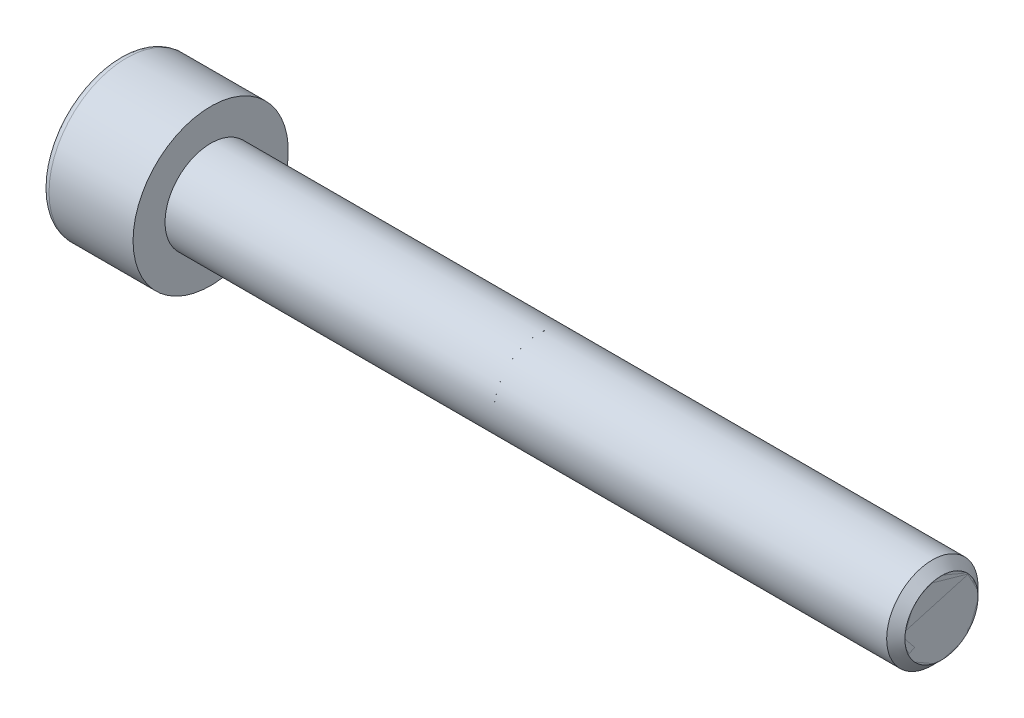
ISO-10303-21;
HEADER;
FILE_DESCRIPTION(('STEP AP214'),'2;1');
FILE_NAME('part.step','',(''),(''),'','','');
FILE_SCHEMA(('AUTOMOTIVE_DESIGN { 1 0 10303 214 1 1 1 1 }'));
ENDSEC;
DATA;
#1=APPLICATION_CONTEXT('core data for automotive mechanical design processes');
#2=APPLICATION_PROTOCOL_DEFINITION('international standard','automotive_design',2000,#1);
#3=PRODUCT_CONTEXT('',#1,'mechanical');
#4=PRODUCT('Part','Part','',(#3));
#5=PRODUCT_RELATED_PRODUCT_CATEGORY('part','',(#4));
#6=PRODUCT_DEFINITION_FORMATION('','',#4);
#7=PRODUCT_DEFINITION_CONTEXT('part definition',#1,'design');
#8=PRODUCT_DEFINITION('design','',#6,#7);
#9=PRODUCT_DEFINITION_SHAPE('','',#8);
#10=(LENGTH_UNIT() NAMED_UNIT(*) SI_UNIT(.MILLI.,.METRE.));
#11=(NAMED_UNIT(*) PLANE_ANGLE_UNIT() SI_UNIT($,.RADIAN.));
#12=(NAMED_UNIT(*) SI_UNIT($,.STERADIAN.) SOLID_ANGLE_UNIT());
#13=UNCERTAINTY_MEASURE_WITH_UNIT(LENGTH_MEASURE(1.E-05),#10,'distance_accuracy_value','');
#14=(GEOMETRIC_REPRESENTATION_CONTEXT(3) GLOBAL_UNCERTAINTY_ASSIGNED_CONTEXT((#13)) GLOBAL_UNIT_ASSIGNED_CONTEXT((#10,
#11,#12)) REPRESENTATION_CONTEXT('',''));
#15=CARTESIAN_POINT('',(0.,0.,0.));
#16=DIRECTION('',(0.,0.,1.));
#17=DIRECTION('',(1.,0.,0.));
#18=AXIS2_PLACEMENT_3D('',#15,#16,#17);
#19=CARTESIAN_POINT('',(2.5,0.,0.));
#20=DIRECTION('',(-1.,0.,0.));
#21=DIRECTION('',(0.,0.,1.));
#22=AXIS2_PLACEMENT_3D('',#19,#20,#21);
#23=PLANE('',#22);
#24=DIRECTION('',(0.,0.,-1.));
#25=VECTOR('',#24,1.);
#26=CARTESIAN_POINT('',(2.5,-2.,-1.154700538379));
#27=LINE('',#26,#25);
#28=CARTESIAN_POINT('',(2.5,-2.00000000000008,-1.15470053837913));
#29=VERTEX_POINT('',#28);
#30=CARTESIAN_POINT('',(2.5,-2.,1.154700538379));
#31=VERTEX_POINT('',#30);
#32=EDGE_CURVE('P0_E65',#29,#31,#27,.F.);
#33=ORIENTED_EDGE('',*,*,#32,.T.);
#34=DIRECTION('',(0.,-0.866025403784429,-0.500000000000017));
#35=VECTOR('',#34,1.);
#36=CARTESIAN_POINT('',(2.5,-2.,1.154700538379));
#37=LINE('',#36,#35);
#38=CARTESIAN_POINT('',(2.5,0.,2.30940107675887));
#39=VERTEX_POINT('',#38);
#40=EDGE_CURVE('P0_E137',#31,#39,#37,.F.);
#41=ORIENTED_EDGE('',*,*,#40,.T.);
#42=DIRECTION('',(0.,-0.866025403784429,0.500000000000017));
#43=VECTOR('',#42,1.);
#44=CARTESIAN_POINT('',(2.5,0.,2.309401076759));
#45=LINE('',#44,#43);
#46=CARTESIAN_POINT('',(2.5,2.00000000000008,1.15470053837913));
#47=VERTEX_POINT('',#46);
#48=EDGE_CURVE('P0_E143',#39,#47,#45,.F.);
#49=ORIENTED_EDGE('',*,*,#48,.T.);
#50=DIRECTION('',(0.,0.,1.));
#51=VECTOR('',#50,1.);
#52=CARTESIAN_POINT('',(2.5,2.,1.154700538379));
#53=LINE('',#52,#51);
#54=CARTESIAN_POINT('',(2.5,2.,-1.154700538379));
#55=VERTEX_POINT('',#54);
#56=EDGE_CURVE('P0_E148',#47,#55,#53,.F.);
#57=ORIENTED_EDGE('',*,*,#56,.T.);
#58=DIRECTION('',(0.,0.866025403784429,0.500000000000017));
#59=VECTOR('',#58,1.);
#60=CARTESIAN_POINT('',(2.5,2.,-1.154700538379));
#61=LINE('',#60,#59);
#62=CARTESIAN_POINT('',(2.5,0.,-2.30940107675887));
#63=VERTEX_POINT('',#62);
#64=EDGE_CURVE('P0_E61',#55,#63,#61,.F.);
#65=ORIENTED_EDGE('',*,*,#64,.T.);
#66=DIRECTION('',(0.,0.866025403784429,-0.500000000000017));
#67=VECTOR('',#66,1.);
#68=CARTESIAN_POINT('',(2.5,0.,-2.309401076759));
#69=LINE('',#68,#67);
#70=EDGE_CURVE('P0_E63',#63,#29,#69,.F.);
#71=ORIENTED_EDGE('',*,*,#70,.T.);
#72=EDGE_LOOP('',(#33,#41,#49,#57,#65,#71));
#73=FACE_BOUND('',#72,.T.);
#74=ADVANCED_FACE('P0_F17',(#73),#23,.T.);
#75=CARTESIAN_POINT('',(2.5,-2.,-1.154700538379));
#76=DIRECTION('',(0.,-1.,0.));
#77=DIRECTION('',(0.,0.,-1.));
#78=AXIS2_PLACEMENT_3D('',#75,#76,#77);
#79=PLANE('',#78);
#80=ORIENTED_EDGE('',*,*,#32,.F.);
#81=DIRECTION('',(1.,0.,0.));
#82=VECTOR('',#81,1.);
#83=CARTESIAN_POINT('',(2.5,-2.0000000000003,-1.15470053837952));
#84=LINE('',#83,#82);
#85=CARTESIAN_POINT('',(0.,-2.00000000000008,-1.15470053837913));
#86=VERTEX_POINT('',#85);
#87=EDGE_CURVE('P0_E71',#29,#86,#84,.F.);
#88=ORIENTED_EDGE('',*,*,#87,.T.);
#89=DIRECTION('',(0.,0.,1.));
#90=VECTOR('',#89,1.);
#91=CARTESIAN_POINT('',(0.,-2.,0.));
#92=LINE('',#91,#90);
#93=CARTESIAN_POINT('',(0.,-2.,1.154700538379));
#94=VERTEX_POINT('',#93);
#95=EDGE_CURVE('P0_E136',#94,#86,#92,.F.);
#96=ORIENTED_EDGE('',*,*,#95,.F.);
#97=DIRECTION('',(1.,0.,0.));
#98=VECTOR('',#97,1.);
#99=CARTESIAN_POINT('',(2.5,-2.,1.154700538379));
#100=LINE('',#99,#98);
#101=EDGE_CURVE('P0_E79',#94,#31,#100,.T.);
#102=ORIENTED_EDGE('',*,*,#101,.T.);
#103=EDGE_LOOP('',(#80,#88,#96,#102));
#104=FACE_BOUND('',#103,.T.);
#105=ADVANCED_FACE('P0_F75',(#104),#79,.F.);
#106=CARTESIAN_POINT('',(2.5,0.,-2.309401076759));
#107=DIRECTION('',(0.,-0.500000000000017,-0.866025403784429));
#108=DIRECTION('',(0.,0.866025403784429,-0.500000000000017));
#109=AXIS2_PLACEMENT_3D('',#106,#107,#108);
#110=PLANE('',#109);
#111=ORIENTED_EDGE('',*,*,#70,.F.);
#112=DIRECTION('',(1.,0.,0.));
#113=VECTOR('',#112,1.);
#114=CARTESIAN_POINT('',(2.5,-3.01841884819964E-13,-2.30940107675848));
#115=LINE('',#114,#113);
#116=CARTESIAN_POINT('',(0.,0.,-2.30940107675887));
#117=VERTEX_POINT('',#116);
#118=EDGE_CURVE('P0_E87',#63,#117,#115,.F.);
#119=ORIENTED_EDGE('',*,*,#118,.T.);
#120=DIRECTION('',(0.,0.866025403784298,-0.500000000000243));
#121=VECTOR('',#120,1.);
#122=CARTESIAN_POINT('',(0.,-2.,-1.154700538379));
#123=LINE('',#122,#121);
#124=EDGE_CURVE('P0_E84',#86,#117,#123,.T.);
#125=ORIENTED_EDGE('',*,*,#124,.F.);
#126=ORIENTED_EDGE('',*,*,#87,.F.);
#127=EDGE_LOOP('',(#111,#119,#125,#126));
#128=FACE_BOUND('',#127,.T.);
#129=ADVANCED_FACE('P0_F82',(#128),#110,.F.);
#130=CARTESIAN_POINT('',(2.5,2.,-1.154700538379));
#131=DIRECTION('',(0.,0.500000000000017,-0.866025403784429));
#132=DIRECTION('',(0.,0.866025403784429,0.500000000000017));
#133=AXIS2_PLACEMENT_3D('',#130,#131,#132);
#134=PLANE('',#133);
#135=ORIENTED_EDGE('',*,*,#64,.F.);
#136=DIRECTION('',(1.,0.,0.));
#137=VECTOR('',#136,1.);
#138=CARTESIAN_POINT('',(2.5,2.,-1.154700538379));
#139=LINE('',#138,#137);
#140=CARTESIAN_POINT('',(0.,2.,-1.154700538379));
#141=VERTEX_POINT('',#140);
#142=EDGE_CURVE('P0_E145',#55,#141,#139,.F.);
#143=ORIENTED_EDGE('',*,*,#142,.T.);
#144=DIRECTION('',(0.,0.866025403784298,0.500000000000243));
#145=VECTOR('',#144,1.);
#146=CARTESIAN_POINT('',(0.,0.,-2.309401076759));
#147=LINE('',#146,#145);
#148=EDGE_CURVE('P0_E155',#117,#141,#147,.T.);
#149=ORIENTED_EDGE('',*,*,#148,.F.);
#150=ORIENTED_EDGE('',*,*,#118,.F.);
#151=EDGE_LOOP('',(#135,#143,#149,#150));
#152=FACE_BOUND('',#151,.T.);
#153=ADVANCED_FACE('P0_F156',(#152),#134,.F.);
#154=CARTESIAN_POINT('',(2.5,2.,1.154700538379));
#155=DIRECTION('',(0.,1.,0.));
#156=DIRECTION('',(0.,0.,1.));
#157=AXIS2_PLACEMENT_3D('',#154,#155,#156);
#158=PLANE('',#157);
#159=ORIENTED_EDGE('',*,*,#56,.F.);
#160=DIRECTION('',(1.,0.,0.));
#161=VECTOR('',#160,1.);
#162=CARTESIAN_POINT('',(2.5,2.0000000000003,1.15470053837952));
#163=LINE('',#162,#161);
#164=CARTESIAN_POINT('',(0.,2.00000000000008,1.15470053837913));
#165=VERTEX_POINT('',#164);
#166=EDGE_CURVE('P0_E140',#47,#165,#163,.F.);
#167=ORIENTED_EDGE('',*,*,#166,.T.);
#168=DIRECTION('',(0.,0.,1.));
#169=VECTOR('',#168,1.);
#170=CARTESIAN_POINT('',(0.,2.,0.));
#171=LINE('',#170,#169);
#172=EDGE_CURVE('P0_E161',#141,#165,#171,.T.);
#173=ORIENTED_EDGE('',*,*,#172,.F.);
#174=ORIENTED_EDGE('',*,*,#142,.F.);
#175=EDGE_LOOP('',(#159,#167,#173,#174));
#176=FACE_BOUND('',#175,.T.);
#177=ADVANCED_FACE('P0_F250',(#176),#158,.F.);
#178=CARTESIAN_POINT('',(2.5,0.,2.309401076759));
#179=DIRECTION('',(0.,0.500000000000017,0.866025403784429));
#180=DIRECTION('',(0.,-0.866025403784429,0.500000000000017));
#181=AXIS2_PLACEMENT_3D('',#178,#179,#180);
#182=PLANE('',#181);
#183=ORIENTED_EDGE('',*,*,#48,.F.);
#184=DIRECTION('',(1.,0.,0.));
#185=VECTOR('',#184,1.);
#186=CARTESIAN_POINT('',(2.5,3.01841884819964E-13,2.30940107675848));
#187=LINE('',#186,#185);
#188=CARTESIAN_POINT('',(0.,0.,2.30940107675887));
#189=VERTEX_POINT('',#188);
#190=EDGE_CURVE('P0_E128',#39,#189,#187,.F.);
#191=ORIENTED_EDGE('',*,*,#190,.T.);
#192=DIRECTION('',(0.,-0.866025403784298,0.500000000000243));
#193=VECTOR('',#192,1.);
#194=CARTESIAN_POINT('',(0.,2.,1.154700538379));
#195=LINE('',#194,#193);
#196=EDGE_CURVE('P0_E169',#165,#189,#195,.T.);
#197=ORIENTED_EDGE('',*,*,#196,.F.);
#198=ORIENTED_EDGE('',*,*,#166,.F.);
#199=EDGE_LOOP('',(#183,#191,#197,#198));
#200=FACE_BOUND('',#199,.T.);
#201=ADVANCED_FACE('P0_F194',(#200),#182,.F.);
#202=CARTESIAN_POINT('',(2.5,-2.,1.154700538379));
#203=DIRECTION('',(0.,-0.500000000000017,0.866025403784429));
#204=DIRECTION('',(0.,-0.866025403784429,-0.500000000000017));
#205=AXIS2_PLACEMENT_3D('',#202,#203,#204);
#206=PLANE('',#205);
#207=ORIENTED_EDGE('',*,*,#40,.F.);
#208=ORIENTED_EDGE('',*,*,#101,.F.);
#209=DIRECTION('',(0.,-0.866025403784298,-0.500000000000243));
#210=VECTOR('',#209,1.);
#211=CARTESIAN_POINT('',(0.,0.,2.309401076759));
#212=LINE('',#211,#210);
#213=EDGE_CURVE('P0_E171',#189,#94,#212,.T.);
#214=ORIENTED_EDGE('',*,*,#213,.F.);
#215=ORIENTED_EDGE('',*,*,#190,.F.);
#216=EDGE_LOOP('',(#207,#208,#214,#215));
#217=FACE_BOUND('',#216,.T.);
#218=ADVANCED_FACE('P0_F189',(#217),#206,.F.);
#219=CARTESIAN_POINT('',(0.,0.,0.));
#220=DIRECTION('',(-1.,0.,0.));
#221=DIRECTION('',(0.,0.,1.));
#222=AXIS2_PLACEMENT_3D('',#219,#220,#221);
#223=PLANE('',#222);
#224=ORIENTED_EDGE('',*,*,#196,.T.);
#225=ORIENTED_EDGE('',*,*,#213,.T.);
#226=ORIENTED_EDGE('',*,*,#95,.T.);
#227=ORIENTED_EDGE('',*,*,#124,.T.);
#228=ORIENTED_EDGE('',*,*,#148,.T.);
#229=ORIENTED_EDGE('',*,*,#172,.T.);
#230=EDGE_LOOP('',(#224,#225,#226,#227,#228,#229));
#231=FACE_BOUND('',#230,.T.);
#232=CARTESIAN_POINT('',(0.,0.,0.));
#233=DIRECTION('',(1.,0.,0.));
#234=DIRECTION('',(0.,-1.,0.));
#235=AXIS2_PLACEMENT_3D('',#232,#233,#234);
#236=CIRCLE('',#235,3.85);
#237=CARTESIAN_POINT('',(0.,-3.85,0.));
#238=VERTEX_POINT('',#237);
#239=CARTESIAN_POINT('',(0.,3.85,0.));
#240=VERTEX_POINT('',#239);
#241=EDGE_CURVE('P0_E36',#238,#240,#236,.T.);
#242=ORIENTED_EDGE('',*,*,#241,.F.);
#243=CARTESIAN_POINT('',(0.,0.,0.));
#244=DIRECTION('',(1.,0.,0.));
#245=DIRECTION('',(0.,1.,0.));
#246=AXIS2_PLACEMENT_3D('',#243,#244,#245);
#247=CIRCLE('',#246,3.85);
#248=EDGE_CURVE('P0_E102',#240,#238,#247,.T.);
#249=ORIENTED_EDGE('',*,*,#248,.F.);
#250=EDGE_LOOP('',(#242,#249));
#251=FACE_BOUND('',#250,.T.);
#252=ADVANCED_FACE('P0_F116',(#231,#251),#223,.T.);
#253=CARTESIAN_POINT('',(0.4,0.,0.));
#254=DIRECTION('',(-1.,0.,0.));
#255=DIRECTION('',(0.,1.,0.));
#256=AXIS2_PLACEMENT_3D('',#253,#254,#255);
#257=TOROIDAL_SURFACE('',#256,3.85,0.4);
#258=CARTESIAN_POINT('',(0.399999999999998,0.,0.));
#259=DIRECTION('',(-1.,0.,0.));
#260=DIRECTION('',(0.,0.,1.));
#261=AXIS2_PLACEMENT_3D('',#258,#259,#260);
#262=CIRCLE('',#261,4.25);
#263=CARTESIAN_POINT('',(0.399999999999998,0.,4.25));
#264=VERTEX_POINT('',#263);
#265=EDGE_CURVE('P0_E98',#264,#264,#262,.F.);
#266=ORIENTED_EDGE('',*,*,#265,.F.);
#267=EDGE_LOOP('',(#266));
#268=FACE_BOUND('',#267,.T.);
#269=ORIENTED_EDGE('',*,*,#248,.T.);
#270=ORIENTED_EDGE('',*,*,#241,.T.);
#271=EDGE_LOOP('',(#269,#270));
#272=FACE_BOUND('',#271,.T.);
#273=ADVANCED_FACE('P0_F110',(#268,#272),#257,.T.);
#274=CARTESIAN_POINT('',(47.25,0.,0.));
#275=DIRECTION('',(-1.,0.,0.));
#276=DIRECTION('',(0.,0.,1.));
#277=AXIS2_PLACEMENT_3D('',#274,#275,#276);
#278=CYLINDRICAL_SURFACE('',#277,4.25);
#279=CARTESIAN_POINT('',(5.,0.,0.));
#280=DIRECTION('',(-1.,0.,0.));
#281=DIRECTION('',(0.,0.,1.));
#282=AXIS2_PLACEMENT_3D('',#279,#280,#281);
#283=CIRCLE('',#282,4.25);
#284=CARTESIAN_POINT('',(5.,0.,4.25));
#285=VERTEX_POINT('',#284);
#286=EDGE_CURVE('P0_E96',#285,#285,#283,.T.);
#287=ORIENTED_EDGE('',*,*,#286,.T.);
#288=EDGE_LOOP('',(#287));
#289=FACE_BOUND('',#288,.T.);
#290=ORIENTED_EDGE('',*,*,#265,.T.);
#291=EDGE_LOOP('',(#290));
#292=FACE_BOUND('',#291,.T.);
#293=ADVANCED_FACE('P0_F115',(#289,#292),#278,.T.);
#294=CARTESIAN_POINT('',(45.,0.,0.));
#295=DIRECTION('',(-1.,0.,0.));
#296=DIRECTION('',(0.,0.,1.));
#297=AXIS2_PLACEMENT_3D('',#294,#295,#296);
#298=PLANE('',#297);
#299=CARTESIAN_POINT('',(45.0000000000159,0.,0.));
#300=DIRECTION('',(-1.,0.,0.));
#301=DIRECTION('',(0.,0.,1.));
#302=AXIS2_PLACEMENT_3D('',#299,#300,#301);
#303=CIRCLE('',#302,2.00000000006639);
#304=CARTESIAN_POINT('',(45.0000000000159,0.,2.00000000006639));
#305=VERTEX_POINT('',#304);
#306=EDGE_CURVE('P0_E93',#305,#305,#303,.T.);
#307=ORIENTED_EDGE('',*,*,#306,.F.);
#308=EDGE_LOOP('',(#307));
#309=FACE_BOUND('',#308,.T.);
#310=ADVANCED_FACE('P0_F210',(#309),#298,.F.);
#311=CARTESIAN_POINT('',(5.,0.,0.));
#312=DIRECTION('',(-1.,0.,0.));
#313=DIRECTION('',(0.,0.,1.));
#314=AXIS2_PLACEMENT_3D('',#311,#312,#313);
#315=PLANE('',#314);
#316=CARTESIAN_POINT('',(5.,0.,0.));
#317=DIRECTION('',(-1.,0.,0.));
#318=DIRECTION('',(0.,0.,1.));
#319=AXIS2_PLACEMENT_3D('',#316,#317,#318);
#320=CIRCLE('',#319,2.5);
#321=CARTESIAN_POINT('',(5.,0.,2.5));
#322=VERTEX_POINT('',#321);
#323=EDGE_CURVE('P0_E28',#322,#322,#320,.F.);
#324=ORIENTED_EDGE('',*,*,#323,.F.);
#325=EDGE_LOOP('',(#324));
#326=FACE_BOUND('',#325,.T.);
#327=ORIENTED_EDGE('',*,*,#286,.F.);
#328=EDGE_LOOP('',(#327));
#329=FACE_BOUND('',#328,.T.);
#330=ADVANCED_FACE('P0_F204',(#326,#329),#315,.F.);
#331=CARTESIAN_POINT('',(44.4999999999709,0.,0.));
#332=DIRECTION('',(-1.,0.,0.));
#333=DIRECTION('',(0.,0.,1.));
#334=AXIS2_PLACEMENT_3D('',#331,#332,#333);
#335=CONICAL_SURFACE('',#334,2.50000000005457,0.785398163340605);
#336=ORIENTED_EDGE('',*,*,#306,.T.);
#337=EDGE_LOOP('',(#336));
#338=FACE_BOUND('',#337,.T.);
#339=CARTESIAN_POINT('',(44.5,0.,0.));
#340=DIRECTION('',(-1.,0.,0.));
#341=DIRECTION('',(0.,0.,1.));
#342=AXIS2_PLACEMENT_3D('',#339,#340,#341);
#343=CIRCLE('',#342,2.5);
#344=CARTESIAN_POINT('',(44.5,0.,2.5));
#345=VERTEX_POINT('',#344);
#346=EDGE_CURVE('P0_E11',#345,#345,#343,.T.);
#347=ORIENTED_EDGE('',*,*,#346,.F.);
#348=EDGE_LOOP('',(#347));
#349=FACE_BOUND('',#348,.T.);
#350=ADVANCED_FACE('P0_F198',(#338,#349),#335,.T.);
#351=CARTESIAN_POINT('',(47.25,0.,0.));
#352=DIRECTION('',(-1.,0.,0.));
#353=DIRECTION('',(0.,0.,1.));
#354=AXIS2_PLACEMENT_3D('',#351,#352,#353);
#355=CYLINDRICAL_SURFACE('',#354,2.5);
#356=ORIENTED_EDGE('',*,*,#346,.T.);
#357=EDGE_LOOP('',(#356));
#358=FACE_BOUND('',#357,.T.);
#359=ORIENTED_EDGE('',*,*,#323,.T.);
#360=EDGE_LOOP('',(#359));
#361=FACE_BOUND('',#360,.T.);
#362=ADVANCED_FACE('P0_F196',(#358,#361),#355,.T.);
#363=CLOSED_SHELL('',(#74,#105,#129,#153,#177,#201,#218,#252,#273,#293,#310,#330,#350,#362));
#364=MANIFOLD_SOLID_BREP('P0_B1',#363);
#365=CARTESIAN_POINT('',(23.,0.,0.));
#366=DIRECTION('',(1.,0.,0.));
#367=DIRECTION('',(0.,0.,-1.));
#368=AXIS2_PLACEMENT_3D('',#365,#366,#367);
#369=PLANE('',#368);
#370=CARTESIAN_POINT('',(23.,-2.5,0.));
#371=CARTESIAN_POINT('',(23.,-2.4986231893624,-0.499595472872885));
#372=CARTESIAN_POINT('',(23.,-2.3097253124102,-0.956496280046036));
#373=CARTESIAN_POINT('',(23.,-2.12006183365365,-1.41524890306816));
#374=CARTESIAN_POINT('',(23.,-1.76775992462112,-1.7677269029941));
#375=CARTESIAN_POINT('',(23.,-1.41648835594815,-2.11917404756596));
#376=CARTESIAN_POINT('',(23.,-0.956706398631792,-2.30968776879388));
#377=CARTESIAN_POINT('',(23.,-0.497671740269835,-2.4998918417148));
#378=CARTESIAN_POINT('',(23.,0.,-2.49999999999999));
#379=CARTESIAN_POINT('',(23.,0.496587573961036,-2.50010792266487));
#380=CARTESIAN_POINT('',(23.,0.956706398631791,-2.30968776879388));
#381=CARTESIAN_POINT('',(23.,1.41557313400629,-2.11978579201904));
#382=CARTESIAN_POINT('',(23.,1.76775992462112,-1.7677269029941));
#383=CARTESIAN_POINT('',(23.,2.1194515679522,-1.41616298143321));
#384=CARTESIAN_POINT('',(23.,2.30972531241023,-0.95649628004597));
#385=CARTESIAN_POINT('',(23.,2.498621641427,-0.500157163418928));
#386=CARTESIAN_POINT('',(23.,2.5,0.));
#387=B_SPLINE_CURVE_WITH_KNOTS('',2,(#370,#371,#372,#373,#374,#375,#376,#377,#378,#379,#380,
#381,#382,#383,#384,#385,#386),.UNSPECIFIED.,.F.,.F.,(3,2,2,2,2,2,2,2,3),(0.,0.125,0.25,0.375,
0.5,0.625,0.75,0.875,1.),.UNSPECIFIED.);
#388=CARTESIAN_POINT('',(23.,-2.5,0.));
#389=VERTEX_POINT('',#388);
#390=CARTESIAN_POINT('',(23.,2.5,0.));
#391=VERTEX_POINT('',#390);
#392=EDGE_CURVE('P1_E31',#389,#391,#387,.T.);
#393=ORIENTED_EDGE('',*,*,#392,.F.);
#394=CARTESIAN_POINT('',(23.,2.5,0.));
#395=CARTESIAN_POINT('',(23.,2.4986231893624,0.49959547287278));
#396=CARTESIAN_POINT('',(23.,2.30972531241023,0.95649628004597));
#397=CARTESIAN_POINT('',(23.,2.12006183365346,1.41524890306875));
#398=CARTESIAN_POINT('',(23.,1.76775992462112,1.7677269029941));
#399=CARTESIAN_POINT('',(23.,1.41648835594781,2.11917404756591));
#400=CARTESIAN_POINT('',(23.,0.956706398631791,2.30968776879388));
#401=CARTESIAN_POINT('',(23.,0.497671740269835,2.499891841715));
#402=CARTESIAN_POINT('',(23.,0.,2.49999999999999));
#403=CARTESIAN_POINT('',(23.,-0.496587573961086,2.50010792266467));
#404=CARTESIAN_POINT('',(23.,-0.956706398631792,2.30968776879388));
#405=CARTESIAN_POINT('',(23.,-1.41557313400599,2.11978579201935));
#406=CARTESIAN_POINT('',(23.,-1.76775992462112,1.7677269029941));
#407=CARTESIAN_POINT('',(23.,-2.11945156795224,1.41616298143317));
#408=CARTESIAN_POINT('',(23.,-2.3097253124102,0.956496280046036));
#409=CARTESIAN_POINT('',(23.,-2.498621641427,0.500157163418852));
#410=CARTESIAN_POINT('',(23.,-2.5,0.));
#411=B_SPLINE_CURVE_WITH_KNOTS('',2,(#394,#395,#396,#397,#398,#399,#400,#401,#402,#403,#404,
#405,#406,#407,#408,#409,#410),.UNSPECIFIED.,.F.,.F.,(3,2,2,2,2,2,2,2,3),(0.,0.125,0.25,0.375,
0.5,0.625,0.75,0.875,1.),.UNSPECIFIED.);
#412=EDGE_CURVE('P1_E29',#391,#389,#411,.T.);
#413=ORIENTED_EDGE('',*,*,#412,.F.);
#414=EDGE_LOOP('',(#393,#413));
#415=FACE_BOUND('',#414,.T.);
#416=ADVANCED_FACE('P1_F16',(#415),#369,.F.);
#417=CARTESIAN_POINT('',(45.,0.,0.));
#418=DIRECTION('',(1.,0.,0.));
#419=DIRECTION('',(0.,0.,-1.));
#420=AXIS2_PLACEMENT_3D('',#417,#418,#419);
#421=PLANE('',#420);
#422=CARTESIAN_POINT('',(45.,0.,0.));
#423=DIRECTION('',(1.,0.,0.));
#424=DIRECTION('',(0.,0.,-1.));
#425=AXIS2_PLACEMENT_3D('',#422,#423,#424);
#426=CIRCLE('',#425,2.);
#427=CARTESIAN_POINT('',(45.,0.,-2.));
#428=VERTEX_POINT('',#427);
#429=EDGE_CURVE('P1_E19',#428,#428,#426,.F.);
#430=ORIENTED_EDGE('',*,*,#429,.F.);
#431=EDGE_LOOP('',(#430));
#432=FACE_BOUND('',#431,.T.);
#433=ADVANCED_FACE('P1_F49',(#432),#421,.T.);
#434=CARTESIAN_POINT('',(23.,0.,0.));
#435=DIRECTION('',(1.,0.,0.));
#436=DIRECTION('',(0.,0.,-1.));
#437=AXIS2_PLACEMENT_3D('',#434,#435,#436);
#438=PLANE('',#437);
#439=CARTESIAN_POINT('',(23.,0.,0.));
#440=DIRECTION('',(1.,0.,0.));
#441=DIRECTION('',(0.,0.,-1.));
#442=AXIS2_PLACEMENT_3D('',#439,#440,#441);
#443=CIRCLE('',#442,2.);
#444=CARTESIAN_POINT('',(23.,0.,-2.));
#445=VERTEX_POINT('',#444);
#446=EDGE_CURVE('P1_E10',#445,#445,#443,.T.);
#447=ORIENTED_EDGE('',*,*,#446,.F.);
#448=EDGE_LOOP('',(#447));
#449=FACE_BOUND('',#448,.T.);
#450=ORIENTED_EDGE('',*,*,#392,.T.);
#451=ORIENTED_EDGE('',*,*,#412,.T.);
#452=EDGE_LOOP('',(#450,#451));
#453=FACE_BOUND('',#452,.T.);
#454=ADVANCED_FACE('P1_F34',(#449,#453),#438,.T.);
#455=CARTESIAN_POINT('',(21.9,0.,0.));
#456=DIRECTION('',(1.,0.,0.));
#457=DIRECTION('',(0.,0.,-1.));
#458=AXIS2_PLACEMENT_3D('',#455,#456,#457);
#459=CYLINDRICAL_SURFACE('',#458,2.);
#460=ORIENTED_EDGE('',*,*,#429,.T.);
#461=EDGE_LOOP('',(#460));
#462=FACE_BOUND('',#461,.T.);
#463=ORIENTED_EDGE('',*,*,#446,.T.);
#464=EDGE_LOOP('',(#463));
#465=FACE_BOUND('',#464,.T.);
#466=ADVANCED_FACE('P1_F48',(#462,#465),#459,.T.);
#467=CLOSED_SHELL('',(#416,#433,#454,#466));
#468=MANIFOLD_SOLID_BREP('P1_B1',#467);
#469=ADVANCED_BREP_SHAPE_REPRESENTATION('',(#18,#364,#468),#14);
#470=SHAPE_DEFINITION_REPRESENTATION(#9,#469);
ENDSEC;
END-ISO-10303-21;
